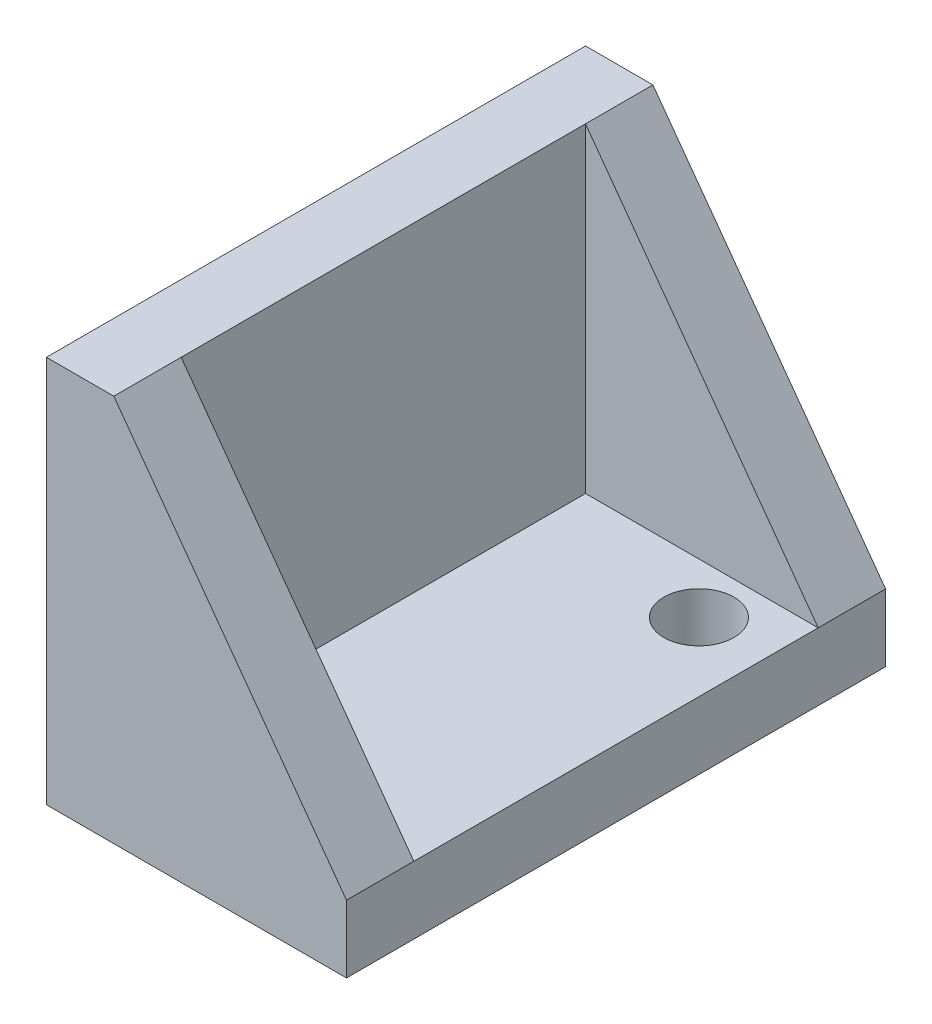
ISO-10303-21;
HEADER;
FILE_DESCRIPTION(('STEP AP214'),'2;1');
FILE_NAME('part.step','',(''),(''),'','','');
FILE_SCHEMA(('AUTOMOTIVE_DESIGN { 1 0 10303 214 1 1 1 1 }'));
ENDSEC;
DATA;
#1=APPLICATION_CONTEXT('core data for automotive mechanical design processes');
#2=APPLICATION_PROTOCOL_DEFINITION('international standard','automotive_design',2000,#1);
#3=PRODUCT_CONTEXT('',#1,'mechanical');
#4=PRODUCT('Part','Part','',(#3));
#5=PRODUCT_RELATED_PRODUCT_CATEGORY('part','',(#4));
#6=PRODUCT_DEFINITION_FORMATION('','',#4);
#7=PRODUCT_DEFINITION_CONTEXT('part definition',#1,'design');
#8=PRODUCT_DEFINITION('design','',#6,#7);
#9=PRODUCT_DEFINITION_SHAPE('','',#8);
#10=(LENGTH_UNIT() NAMED_UNIT(*) SI_UNIT(.MILLI.,.METRE.));
#11=(NAMED_UNIT(*) PLANE_ANGLE_UNIT() SI_UNIT($,.RADIAN.));
#12=(NAMED_UNIT(*) SI_UNIT($,.STERADIAN.) SOLID_ANGLE_UNIT());
#13=UNCERTAINTY_MEASURE_WITH_UNIT(LENGTH_MEASURE(1.E-05),#10,'distance_accuracy_value','');
#14=(GEOMETRIC_REPRESENTATION_CONTEXT(3) GLOBAL_UNCERTAINTY_ASSIGNED_CONTEXT((#13)) GLOBAL_UNIT_ASSIGNED_CONTEXT((#10,
#11,#12)) REPRESENTATION_CONTEXT('',''));
#15=CARTESIAN_POINT('',(0.,0.,0.));
#16=DIRECTION('',(0.,0.,1.));
#17=DIRECTION('',(1.,0.,0.));
#18=AXIS2_PLACEMENT_3D('',#15,#16,#17);
#19=CARTESIAN_POINT('',(130.604002291105,118.048344881126,1057.012834154));
#20=DIRECTION('',(1.,0.,0.));
#21=DIRECTION('',(0.,0.,-1.));
#22=AXIS2_PLACEMENT_3D('',#19,#20,#21);
#23=PLANE('',#22);
#24=DIRECTION('',(0.,-1.,0.));
#25=VECTOR('',#24,1.);
#26=CARTESIAN_POINT('',(130.604002291105,118.048344881126,1101.462834154));
#27=LINE('',#26,#25);
#28=CARTESIAN_POINT('',(130.604002291105,118.048344881126,1101.462834154));
#29=VERTEX_POINT('',#28);
#30=CARTESIAN_POINT('',(130.604002291105,87.8815745540004,1101.462834154));
#31=VERTEX_POINT('',#30);
#32=EDGE_CURVE('E181',#29,#31,#27,.T.);
#33=ORIENTED_EDGE('',*,*,#32,.T.);
#34=DIRECTION('',(0.,0.,1.));
#35=VECTOR('',#34,1.);
#36=CARTESIAN_POINT('',(130.604002291105,87.8815745540004,1057.012834154));
#37=LINE('',#36,#35);
#38=CARTESIAN_POINT('',(130.604002291105,87.8815745540004,1063.362834154));
#39=VERTEX_POINT('',#38);
#40=EDGE_CURVE('E152',#39,#31,#37,.T.);
#41=ORIENTED_EDGE('',*,*,#40,.F.);
#42=DIRECTION('',(0.,-1.,0.));
#43=VECTOR('',#42,1.);
#44=CARTESIAN_POINT('',(130.604002291105,118.048344881126,1063.362834154));
#45=LINE('',#44,#43);
#46=CARTESIAN_POINT('',(130.604002291105,118.048344881126,1063.362834154));
#47=VERTEX_POINT('',#46);
#48=EDGE_CURVE('E173',#47,#39,#45,.T.);
#49=ORIENTED_EDGE('',*,*,#48,.F.);
#50=DIRECTION('',(0.,0.,1.));
#51=VECTOR('',#50,1.);
#52=CARTESIAN_POINT('',(130.604002291105,118.048344881126,1057.012834154));
#53=LINE('',#52,#51);
#54=EDGE_CURVE('E151',#47,#29,#53,.T.);
#55=ORIENTED_EDGE('',*,*,#54,.T.);
#56=EDGE_LOOP('',(#33,#41,#49,#55));
#57=FACE_BOUND('',#56,.T.);
#58=ADVANCED_FACE('F43',(#57),#23,.T.);
#59=CARTESIAN_POINT('',(152.527062484,87.8815745540004,1057.012834154));
#60=DIRECTION('',(0.,1.,0.));
#61=DIRECTION('',(0.,0.,1.));
#62=AXIS2_PLACEMENT_3D('',#59,#60,#61);
#63=PLANE('',#62);
#64=DIRECTION('',(1.,0.,0.));
#65=VECTOR('',#64,1.);
#66=CARTESIAN_POINT('',(152.527062484,87.8815745540004,1101.462834154));
#67=LINE('',#66,#65);
#68=CARTESIAN_POINT('',(152.527062484,87.8815745540004,1101.462834154));
#69=VERTEX_POINT('',#68);
#70=EDGE_CURVE('E179',#31,#69,#67,.T.);
#71=ORIENTED_EDGE('',*,*,#70,.T.);
#72=DIRECTION('',(0.,0.,1.));
#73=VECTOR('',#72,1.);
#74=CARTESIAN_POINT('',(152.527062484,87.8815745540004,1057.012834154));
#75=LINE('',#74,#73);
#76=CARTESIAN_POINT('',(152.527062484,87.8815745540004,1063.362834154));
#77=VERTEX_POINT('',#76);
#78=EDGE_CURVE('E129',#77,#69,#75,.T.);
#79=ORIENTED_EDGE('',*,*,#78,.F.);
#80=DIRECTION('',(1.,0.,0.));
#81=VECTOR('',#80,1.);
#82=CARTESIAN_POINT('',(152.527062484,87.8815745540004,1063.362834154));
#83=LINE('',#82,#81);
#84=EDGE_CURVE('E67',#39,#77,#83,.T.);
#85=ORIENTED_EDGE('',*,*,#84,.F.);
#86=ORIENTED_EDGE('',*,*,#40,.T.);
#87=EDGE_LOOP('',(#71,#79,#85,#86));
#88=FACE_BOUND('',#87,.T.);
#89=CARTESIAN_POINT('',(146.050062484,87.8815745540004,1068.125334154));
#90=DIRECTION('',(0.,1.,0.));
#91=DIRECTION('',(0.,0.,1.));
#92=AXIS2_PLACEMENT_3D('',#89,#90,#91);
#93=CIRCLE('',#92,3.30199999999995);
#94=CARTESIAN_POINT('',(146.050062484,87.8815745540004,1071.427334154));
#95=VERTEX_POINT('',#94);
#96=EDGE_CURVE('E47',#95,#95,#93,.F.);
#97=ORIENTED_EDGE('',*,*,#96,.T.);
#98=EDGE_LOOP('',(#97));
#99=FACE_BOUND('',#98,.T.);
#100=ADVANCED_FACE('F191',(#88,#99),#63,.T.);
#101=CARTESIAN_POINT('',(124.254002291105,81.5315745540004,1057.012834154));
#102=DIRECTION('',(0.,-1.,0.));
#103=DIRECTION('',(0.,0.,-1.));
#104=AXIS2_PLACEMENT_3D('',#101,#102,#103);
#105=PLANE('',#104);
#106=CARTESIAN_POINT('',(146.050062484,81.5315745540004,1068.125334154));
#107=DIRECTION('',(0.,-1.,0.));
#108=DIRECTION('',(0.,0.,-1.));
#109=AXIS2_PLACEMENT_3D('',#106,#107,#108);
#110=CIRCLE('',#109,3.30199999999995);
#111=CARTESIAN_POINT('',(146.050062484,81.5315745540004,1064.823334154));
#112=VERTEX_POINT('',#111);
#113=EDGE_CURVE('E141',#112,#112,#110,.F.);
#114=ORIENTED_EDGE('',*,*,#113,.T.);
#115=EDGE_LOOP('',(#114));
#116=FACE_BOUND('',#115,.T.);
#117=DIRECTION('',(1.,0.,0.));
#118=VECTOR('',#117,1.);
#119=CARTESIAN_POINT('',(124.254002291105,81.5315745540004,1107.812834154));
#120=LINE('',#119,#118);
#121=CARTESIAN_POINT('',(124.254002291105,81.5315745540004,1107.812834154));
#122=VERTEX_POINT('',#121);
#123=CARTESIAN_POINT('',(152.527062484,81.5315745540004,1107.812834154));
#124=VERTEX_POINT('',#123);
#125=EDGE_CURVE('E136',#122,#124,#120,.T.);
#126=ORIENTED_EDGE('',*,*,#125,.F.);
#127=DIRECTION('',(0.,0.,1.));
#128=VECTOR('',#127,1.);
#129=CARTESIAN_POINT('',(124.254002291105,81.5315745540004,1057.012834154));
#130=LINE('',#129,#128);
#131=CARTESIAN_POINT('',(124.254002291105,81.5315745540004,1057.012834154));
#132=VERTEX_POINT('',#131);
#133=EDGE_CURVE('E11',#132,#122,#130,.T.);
#134=ORIENTED_EDGE('',*,*,#133,.F.);
#135=DIRECTION('',(1.,0.,0.));
#136=VECTOR('',#135,1.);
#137=CARTESIAN_POINT('',(124.254002291105,81.5315745540004,1057.012834154));
#138=LINE('',#137,#136);
#139=CARTESIAN_POINT('',(152.527062484,81.5315745540004,1057.012834154));
#140=VERTEX_POINT('',#139);
#141=EDGE_CURVE('E145',#132,#140,#138,.T.);
#142=ORIENTED_EDGE('',*,*,#141,.T.);
#143=DIRECTION('',(0.,0.,1.));
#144=VECTOR('',#143,1.);
#145=CARTESIAN_POINT('',(152.527062484,81.5315745540004,1057.012834154));
#146=LINE('',#145,#144);
#147=EDGE_CURVE('E155',#140,#124,#146,.T.);
#148=ORIENTED_EDGE('',*,*,#147,.T.);
#149=EDGE_LOOP('',(#126,#134,#142,#148));
#150=FACE_BOUND('',#149,.T.);
#151=ADVANCED_FACE('F45',(#116,#150),#105,.T.);
#152=CARTESIAN_POINT('',(124.254002291105,81.5315745540004,1057.012834154));
#153=DIRECTION('',(-1.,0.,0.));
#154=DIRECTION('',(0.,0.,1.));
#155=AXIS2_PLACEMENT_3D('',#152,#153,#154);
#156=PLANE('',#155);
#157=DIRECTION('',(0.,-1.,0.));
#158=VECTOR('',#157,1.);
#159=CARTESIAN_POINT('',(124.254002291105,81.5315745540004,1107.812834154));
#160=LINE('',#159,#158);
#161=CARTESIAN_POINT('',(124.254002291105,118.048344881126,1107.812834154));
#162=VERTEX_POINT('',#161);
#163=EDGE_CURVE('E139',#162,#122,#160,.T.);
#164=ORIENTED_EDGE('',*,*,#163,.F.);
#165=DIRECTION('',(0.,0.,1.));
#166=VECTOR('',#165,1.);
#167=CARTESIAN_POINT('',(124.254002291105,118.048344881126,1057.012834154));
#168=LINE('',#167,#166);
#169=CARTESIAN_POINT('',(124.254002291105,118.048344881126,1057.012834154));
#170=VERTEX_POINT('',#169);
#171=EDGE_CURVE('E52',#170,#162,#168,.T.);
#172=ORIENTED_EDGE('',*,*,#171,.F.);
#173=DIRECTION('',(0.,-1.,0.));
#174=VECTOR('',#173,1.);
#175=CARTESIAN_POINT('',(124.254002291105,81.5315745540004,1057.012834154));
#176=LINE('',#175,#174);
#177=EDGE_CURVE('E156',#170,#132,#176,.T.);
#178=ORIENTED_EDGE('',*,*,#177,.T.);
#179=ORIENTED_EDGE('',*,*,#133,.T.);
#180=EDGE_LOOP('',(#164,#172,#178,#179));
#181=FACE_BOUND('',#180,.T.);
#182=ADVANCED_FACE('F227',(#181),#156,.T.);
#183=CARTESIAN_POINT('',(124.254002291105,118.048344881126,1057.012834154));
#184=DIRECTION('',(0.,1.,0.));
#185=DIRECTION('',(0.,0.,1.));
#186=AXIS2_PLACEMENT_3D('',#183,#184,#185);
#187=PLANE('',#186);
#188=DIRECTION('',(-1.,0.,0.));
#189=VECTOR('',#188,1.);
#190=CARTESIAN_POINT('',(124.254002291105,118.048344881126,1107.812834154));
#191=LINE('',#190,#189);
#192=CARTESIAN_POINT('',(130.604002291105,118.048344881126,1107.812834154));
#193=VERTEX_POINT('',#192);
#194=EDGE_CURVE('E137',#193,#162,#191,.T.);
#195=ORIENTED_EDGE('',*,*,#194,.F.);
#196=DIRECTION('',(0.,0.,-1.));
#197=VECTOR('',#196,1.);
#198=CARTESIAN_POINT('',(130.604002291105,118.048344881126,1107.812834154));
#199=LINE('',#198,#197);
#200=EDGE_CURVE('E117',#193,#29,#199,.T.);
#201=ORIENTED_EDGE('',*,*,#200,.T.);
#202=ORIENTED_EDGE('',*,*,#54,.F.);
#203=CARTESIAN_POINT('',(130.604002291105,118.048344881126,1057.012834154));
#204=VERTEX_POINT('',#203);
#205=EDGE_CURVE('E149',#204,#47,#53,.T.);
#206=ORIENTED_EDGE('',*,*,#205,.F.);
#207=DIRECTION('',(-1.,0.,0.));
#208=VECTOR('',#207,1.);
#209=CARTESIAN_POINT('',(124.254002291105,118.048344881126,1057.012834154));
#210=LINE('',#209,#208);
#211=EDGE_CURVE('E159',#204,#170,#210,.T.);
#212=ORIENTED_EDGE('',*,*,#211,.T.);
#213=ORIENTED_EDGE('',*,*,#171,.T.);
#214=EDGE_LOOP('',(#195,#201,#202,#206,#212,#213));
#215=FACE_BOUND('',#214,.T.);
#216=ADVANCED_FACE('F219',(#215),#187,.T.);
#217=CARTESIAN_POINT('',(152.527062484,81.5315745540004,1057.012834154));
#218=DIRECTION('',(1.,0.,0.));
#219=DIRECTION('',(0.,0.,-1.));
#220=AXIS2_PLACEMENT_3D('',#217,#218,#219);
#221=PLANE('',#220);
#222=DIRECTION('',(0.,1.,0.));
#223=VECTOR('',#222,1.);
#224=CARTESIAN_POINT('',(152.527062484,81.5315745540004,1107.812834154));
#225=LINE('',#224,#223);
#226=CARTESIAN_POINT('',(152.527062484,87.8815745540004,1107.812834154));
#227=VERTEX_POINT('',#226);
#228=EDGE_CURVE('E126',#124,#227,#225,.T.);
#229=ORIENTED_EDGE('',*,*,#228,.F.);
#230=ORIENTED_EDGE('',*,*,#147,.F.);
#231=DIRECTION('',(0.,1.,0.));
#232=VECTOR('',#231,1.);
#233=CARTESIAN_POINT('',(152.527062484,81.5315745540004,1057.012834154));
#234=LINE('',#233,#232);
#235=CARTESIAN_POINT('',(152.527062484,87.8815745540004,1057.012834154));
#236=VERTEX_POINT('',#235);
#237=EDGE_CURVE('E164',#140,#236,#234,.T.);
#238=ORIENTED_EDGE('',*,*,#237,.T.);
#239=EDGE_CURVE('E154',#236,#77,#75,.T.);
#240=ORIENTED_EDGE('',*,*,#239,.T.);
#241=ORIENTED_EDGE('',*,*,#78,.T.);
#242=DIRECTION('',(0.,0.,-1.));
#243=VECTOR('',#242,1.);
#244=CARTESIAN_POINT('',(152.527062484,87.8815745540004,1107.812834154));
#245=LINE('',#244,#243);
#246=EDGE_CURVE('E114',#227,#69,#245,.T.);
#247=ORIENTED_EDGE('',*,*,#246,.F.);
#248=EDGE_LOOP('',(#229,#230,#238,#240,#241,#247));
#249=FACE_BOUND('',#248,.T.);
#250=ADVANCED_FACE('F124',(#249),#221,.T.);
#251=CARTESIAN_POINT('',(0.,0.,1057.012834154));
#252=DIRECTION('',(0.,0.,1.));
#253=DIRECTION('',(1.,0.,0.));
#254=AXIS2_PLACEMENT_3D('',#251,#252,#253);
#255=PLANE('',#254);
#256=ORIENTED_EDGE('',*,*,#211,.F.);
#257=DIRECTION('',(-0.58788386114391,0.808945341668106,0.));
#258=VECTOR('',#257,1.);
#259=CARTESIAN_POINT('',(130.604002291105,118.048344881126,1057.012834154));
#260=LINE('',#259,#258);
#261=EDGE_CURVE('E131',#236,#204,#260,.T.);
#262=ORIENTED_EDGE('',*,*,#261,.F.);
#263=ORIENTED_EDGE('',*,*,#237,.F.);
#264=ORIENTED_EDGE('',*,*,#141,.F.);
#265=ORIENTED_EDGE('',*,*,#177,.F.);
#266=EDGE_LOOP('',(#256,#262,#263,#264,#265));
#267=FACE_BOUND('',#266,.T.);
#268=ADVANCED_FACE('F210',(#267),#255,.F.);
#269=CARTESIAN_POINT('',(0.,0.,1107.812834154));
#270=DIRECTION('',(0.,0.,1.));
#271=DIRECTION('',(1.,0.,0.));
#272=AXIS2_PLACEMENT_3D('',#269,#270,#271);
#273=PLANE('',#272);
#274=DIRECTION('',(-0.58788386114391,0.808945341668106,0.));
#275=VECTOR('',#274,1.);
#276=CARTESIAN_POINT('',(130.604002291105,118.048344881126,1107.812834154));
#277=LINE('',#276,#275);
#278=EDGE_CURVE('E111',#227,#193,#277,.T.);
#279=ORIENTED_EDGE('',*,*,#278,.T.);
#280=ORIENTED_EDGE('',*,*,#194,.T.);
#281=ORIENTED_EDGE('',*,*,#163,.T.);
#282=ORIENTED_EDGE('',*,*,#125,.T.);
#283=ORIENTED_EDGE('',*,*,#228,.T.);
#284=EDGE_LOOP('',(#279,#280,#281,#282,#283));
#285=FACE_BOUND('',#284,.T.);
#286=ADVANCED_FACE('F134',(#285),#273,.T.);
#287=CARTESIAN_POINT('',(146.050062484,81.5315745540004,1068.125334154));
#288=DIRECTION('',(0.,-1.,0.));
#289=DIRECTION('',(0.,0.,-1.));
#290=AXIS2_PLACEMENT_3D('',#287,#288,#289);
#291=CYLINDRICAL_SURFACE('',#290,3.30199999999995);
#292=ORIENTED_EDGE('',*,*,#113,.F.);
#293=EDGE_LOOP('',(#292));
#294=FACE_BOUND('',#293,.T.);
#295=ORIENTED_EDGE('',*,*,#96,.F.);
#296=EDGE_LOOP('',(#295));
#297=FACE_BOUND('',#296,.T.);
#298=ADVANCED_FACE('F198',(#294,#297),#291,.F.);
#299=CARTESIAN_POINT('',(130.604002291105,118.048344881126,1063.362834154));
#300=DIRECTION('',(-0.808945341668106,-0.587883861143909,0.));
#301=DIRECTION('',(0.58788386114391,-0.808945341668106,0.));
#302=AXIS2_PLACEMENT_3D('',#299,#300,#301);
#303=PLANE('',#302);
#304=ORIENTED_EDGE('',*,*,#261,.T.);
#305=ORIENTED_EDGE('',*,*,#205,.T.);
#306=DIRECTION('',(-0.58788386114391,0.808945341668106,0.));
#307=VECTOR('',#306,1.);
#308=CARTESIAN_POINT('',(130.604002291105,118.048344881126,1063.362834154));
#309=LINE('',#308,#307);
#310=EDGE_CURVE('E60',#77,#47,#309,.T.);
#311=ORIENTED_EDGE('',*,*,#310,.F.);
#312=ORIENTED_EDGE('',*,*,#239,.F.);
#313=EDGE_LOOP('',(#304,#305,#311,#312));
#314=FACE_BOUND('',#313,.T.);
#315=ADVANCED_FACE('F200',(#314),#303,.F.);
#316=CARTESIAN_POINT('',(0.,0.,1063.362834154));
#317=DIRECTION('',(0.,0.,-1.));
#318=DIRECTION('',(-1.,0.,0.));
#319=AXIS2_PLACEMENT_3D('',#316,#317,#318);
#320=PLANE('',#319);
#321=ORIENTED_EDGE('',*,*,#48,.T.);
#322=ORIENTED_EDGE('',*,*,#84,.T.);
#323=ORIENTED_EDGE('',*,*,#310,.T.);
#324=EDGE_LOOP('',(#321,#322,#323));
#325=FACE_BOUND('',#324,.T.);
#326=ADVANCED_FACE('F207',(#325),#320,.F.);
#327=CARTESIAN_POINT('',(130.604002291105,118.048344881126,1107.812834154));
#328=DIRECTION('',(-0.808945341668106,-0.587883861143909,0.));
#329=DIRECTION('',(0.58788386114391,-0.808945341668106,0.));
#330=AXIS2_PLACEMENT_3D('',#327,#328,#329);
#331=PLANE('',#330);
#332=DIRECTION('',(-0.58788386114391,0.808945341668106,0.));
#333=VECTOR('',#332,1.);
#334=CARTESIAN_POINT('',(130.604002291105,118.048344881126,1101.462834154));
#335=LINE('',#334,#333);
#336=EDGE_CURVE('E121',#69,#29,#335,.T.);
#337=ORIENTED_EDGE('',*,*,#336,.T.);
#338=ORIENTED_EDGE('',*,*,#200,.F.);
#339=ORIENTED_EDGE('',*,*,#278,.F.);
#340=ORIENTED_EDGE('',*,*,#246,.T.);
#341=EDGE_LOOP('',(#337,#338,#339,#340));
#342=FACE_BOUND('',#341,.T.);
#343=ADVANCED_FACE('F113',(#342),#331,.F.);
#344=CARTESIAN_POINT('',(0.,0.,1101.462834154));
#345=DIRECTION('',(0.,0.,-1.));
#346=DIRECTION('',(-1.,0.,0.));
#347=AXIS2_PLACEMENT_3D('',#344,#345,#346);
#348=PLANE('',#347);
#349=ORIENTED_EDGE('',*,*,#32,.F.);
#350=ORIENTED_EDGE('',*,*,#336,.F.);
#351=ORIENTED_EDGE('',*,*,#70,.F.);
#352=EDGE_LOOP('',(#349,#350,#351));
#353=FACE_BOUND('',#352,.T.);
#354=ADVANCED_FACE('F190',(#353),#348,.T.);
#355=CLOSED_SHELL('',(#58,#100,#151,#182,#216,#250,#268,#286,#298,#315,#326,#343,#354));
#356=MANIFOLD_SOLID_BREP('B2',#355);
#357=ADVANCED_BREP_SHAPE_REPRESENTATION('',(#18,#356),#14);
#358=SHAPE_DEFINITION_REPRESENTATION(#9,#357);
ENDSEC;
END-ISO-10303-21;
